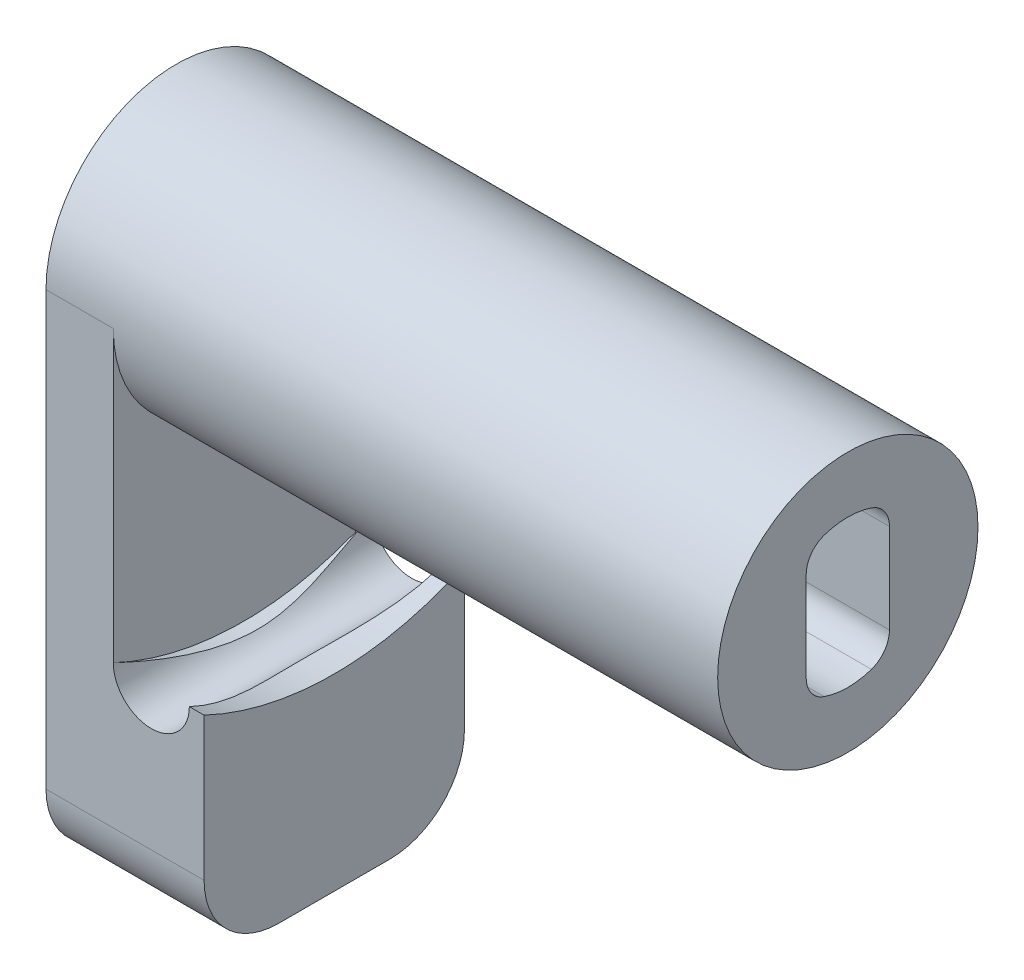
ISO-10303-21;
HEADER;
FILE_DESCRIPTION(('STEP AP214'),'2;1');
FILE_NAME('part.step','',(''),(''),'','','');
FILE_SCHEMA(('AUTOMOTIVE_DESIGN { 1 0 10303 214 1 1 1 1 }'));
ENDSEC;
DATA;
#1=APPLICATION_CONTEXT('core data for automotive mechanical design processes');
#2=APPLICATION_PROTOCOL_DEFINITION('international standard','automotive_design',2000,#1);
#3=PRODUCT_CONTEXT('',#1,'mechanical');
#4=PRODUCT('Part','Part','',(#3));
#5=PRODUCT_RELATED_PRODUCT_CATEGORY('part','',(#4));
#6=PRODUCT_DEFINITION_FORMATION('','',#4);
#7=PRODUCT_DEFINITION_CONTEXT('part definition',#1,'design');
#8=PRODUCT_DEFINITION('design','',#6,#7);
#9=PRODUCT_DEFINITION_SHAPE('','',#8);
#10=(LENGTH_UNIT() NAMED_UNIT(*) SI_UNIT(.MILLI.,.METRE.));
#11=(NAMED_UNIT(*) PLANE_ANGLE_UNIT() SI_UNIT($,.RADIAN.));
#12=(NAMED_UNIT(*) SI_UNIT($,.STERADIAN.) SOLID_ANGLE_UNIT());
#13=UNCERTAINTY_MEASURE_WITH_UNIT(LENGTH_MEASURE(1.E-05),#10,'distance_accuracy_value','');
#14=(GEOMETRIC_REPRESENTATION_CONTEXT(3) GLOBAL_UNCERTAINTY_ASSIGNED_CONTEXT((#13)) GLOBAL_UNIT_ASSIGNED_CONTEXT((#10,
#11,#12)) REPRESENTATION_CONTEXT('',''));
#15=CARTESIAN_POINT('',(0.,0.,0.));
#16=DIRECTION('',(0.,0.,1.));
#17=DIRECTION('',(1.,0.,0.));
#18=AXIS2_PLACEMENT_3D('',#15,#16,#17);
#19=CARTESIAN_POINT('',(-13.1529612058234,-1.08551700717587,0.));
#20=DIRECTION('',(1.,0.,0.));
#21=DIRECTION('',(0.,0.,-1.));
#22=AXIS2_PLACEMENT_3D('',#19,#20,#21);
#23=CYLINDRICAL_SURFACE('',#22,20.32);
#24=CARTESIAN_POINT('',(4.516000112,-19.431,-8.7376));
#25=CARTESIAN_POINT('',(4.51603731749877,-19.5177287528389,-8.5555150718596));
#26=CARTESIAN_POINT('',(4.52041756207572,-19.6017131843481,-8.37218776939642));
#27=CARTESIAN_POINT('',(4.53649669182362,-19.7640441249381,-8.00346974642191));
#28=CARTESIAN_POINT('',(4.54819196914922,-19.8423933921093,-7.81808008733202));
#29=CARTESIAN_POINT('',(4.57750524371221,-19.9932298337656,-7.44587482763609));
#30=CARTESIAN_POINT('',(4.59511059020355,-20.0657291226541,-7.25906309881219));
#31=CARTESIAN_POINT('',(4.6350984527638,-20.2050234726588,-6.88381652494582));
#32=CARTESIAN_POINT('',(4.65748161048571,-20.2718177659139,-6.69538146515752));
#33=CARTESIAN_POINT('',(4.73063386302325,-20.4648184988648,-6.12434180645761));
#34=CARTESIAN_POINT('',(4.78709294470231,-20.5822383370678,-5.73947026967527));
#35=CARTESIAN_POINT('',(4.90685418840569,-20.7938885012978,-4.9642812598655));
#36=CARTESIAN_POINT('',(4.97016061356254,-20.8881042595447,-4.57396052741235));
#37=CARTESIAN_POINT('',(5.09296430268536,-21.0504853530193,-3.80167743454365));
#38=CARTESIAN_POINT('',(5.15251770203577,-21.1194348094891,-3.41988894288582));
#39=CARTESIAN_POINT('',(5.26139557184988,-21.235522973599,-2.65150880361196));
#40=CARTESIAN_POINT('',(5.31072214253996,-21.2826661619228,-2.26491815950602));
#41=CARTESIAN_POINT('',(5.36996981115032,-21.3365954064752,-1.68338288453226));
#42=CARTESIAN_POINT('',(5.38722709898677,-21.3517501970454,-1.48994178039054));
#43=CARTESIAN_POINT('',(5.41595618999079,-21.376527934953,-1.10226762126502));
#44=CARTESIAN_POINT('',(5.42742814364184,-21.3861510261775,-0.908034587012759));
#45=CARTESIAN_POINT('',(5.44384213927347,-21.399814361787,-0.519182820192744));
#46=CARTESIAN_POINT('',(5.4487872492382,-21.4038572292324,-0.324564311936539));
#47=CARTESIAN_POINT('',(5.45182482094318,-21.4063463641171,0.0647645243224691));
#48=CARTESIAN_POINT('',(5.44991713093645,-21.4047925076236,0.25947485426309));
#49=CARTESIAN_POINT('',(5.43791560220297,-21.3949008098425,0.702031122744907));
#50=CARTESIAN_POINT('',(5.42571740508307,-21.3848170128464,0.949783737628716));
#51=CARTESIAN_POINT('',(5.39165308592273,-21.3556506908518,1.44409389752363));
#52=CARTESIAN_POINT('',(5.36978570537389,-21.3365669944351,1.69065128274307));
#53=CARTESIAN_POINT('',(5.31841361275851,-21.2894896279478,2.1824283587983));
#54=CARTESIAN_POINT('',(5.28889873312364,-21.2614840845627,2.42764582157201));
#55=CARTESIAN_POINT('',(5.22459428249614,-21.1966813330368,2.91619580195046));
#56=CARTESIAN_POINT('',(5.18980480135659,-21.1598842746537,3.15952835159059));
#57=CARTESIAN_POINT('',(5.11704832924566,-21.0773221209748,3.64572203666351));
#58=CARTESIAN_POINT('',(5.0790635160548,-21.03150451255,3.88857157186214));
#59=CARTESIAN_POINT('',(5.00229123413209,-20.931076768087,4.37232221506012));
#60=CARTESIAN_POINT('',(4.96350366591518,-20.876465536504,4.61322307635335));
#61=CARTESIAN_POINT('',(4.84906519895848,-20.6995446264881,5.332540827966));
#62=CARTESIAN_POINT('',(4.77524179271125,-20.5640491428703,5.80815334623814));
#63=CARTESIAN_POINT('',(4.68332294902369,-20.3429656895821,6.48856420455001));
#64=CARTESIAN_POINT('',(4.6570609963979,-20.2715032996002,6.69693796652465));
#65=CARTESIAN_POINT('',(4.60994604418476,-20.1216333367819,7.1117720077411));
#66=CARTESIAN_POINT('',(4.58909206679276,-20.0432270229058,7.31823262637574));
#67=CARTESIAN_POINT('',(4.55437450524215,-19.8797799982117,7.72829969041081));
#68=CARTESIAN_POINT('',(4.5404869822015,-19.7947631829191,7.93191353995666));
#69=CARTESIAN_POINT('',(4.52609874323223,-19.6621542658722,8.23548148381315));
#70=CARTESIAN_POINT('',(4.52237634337057,-19.617088565154,8.33639443081653));
#71=CARTESIAN_POINT('',(4.51732854253573,-19.525288679427,8.53753160177582));
#72=CARTESIAN_POINT('',(4.51600340983757,-19.4785543082763,8.63775574739877));
#73=CARTESIAN_POINT('',(4.516000112,-19.431,8.7376));
#74=B_SPLINE_CURVE_WITH_KNOTS('',3,(#24,#25,#26,#27,#28,#29,#30,#31,#32,#33,#34,#35,#36,#37,#38,
#39,#40,#41,#42,#43,#44,#45,#46,#47,#48,#49,#50,#51,#52,#53,#54,#55,#56,#57,#58,#59,#60,#61,#62,
#63,#64,#65,#66,#67,#68,#69,#70,#71,#72,#73),.UNSPECIFIED.,.F.,.F.,(4,2,2,2,2,2,2,2,2,2,2,2,2,2,
2,2,2,2,2,2,2,2,2,2,4),(0.,0.604902094843688,1.20950608108938,1.81282405341211,2.41622310148412,
3.6342575228127,4.8530547015255,6.02995777472376,7.20661891401831,7.79087980929366,
8.37512550645878,8.95909647731702,9.54308037958888,10.2874501190093,11.0319167716234,
11.7773783385945,12.522827208021,13.2727513586984,14.0227690103302,15.5210179611022,
16.1864245199329,16.8517106839849,17.5146947852316,17.8464021322582,18.1781465979217),.UNSPECIFIED.);
#75=CARTESIAN_POINT('',(4.516000112,-19.431,-8.7376));
#76=VERTEX_POINT('',#75);
#77=CARTESIAN_POINT('',(4.516000112,-19.431,8.7376));
#78=VERTEX_POINT('',#77);
#79=EDGE_CURVE('E228',#76,#78,#74,.T.);
#80=ORIENTED_EDGE('',*,*,#79,.F.);
#81=CARTESIAN_POINT('',(4.516000112,-1.08551700717587,0.));
#82=DIRECTION('',(-1.,0.,0.));
#83=DIRECTION('',(0.,0.,1.));
#84=AXIS2_PLACEMENT_3D('',#81,#82,#83);
#85=CIRCLE('',#84,20.32);
#86=EDGE_CURVE('E254',#76,#78,#85,.T.);
#87=ORIENTED_EDGE('',*,*,#86,.T.);
#88=EDGE_LOOP('',(#80,#87));
#89=FACE_BOUND('',#88,.T.);
#90=ADVANCED_FACE('F50',(#89),#23,.F.);
#91=CARTESIAN_POINT('',(45.085,0.,0.));
#92=DIRECTION('',(-1.,0.,0.));
#93=DIRECTION('',(0.,0.,1.));
#94=AXIS2_PLACEMENT_3D('',#91,#92,#93);
#95=CYLINDRICAL_SURFACE('',#94,8.7376);
#96=CARTESIAN_POINT('',(4.516000112,0.,0.));
#97=DIRECTION('',(-1.,0.,0.));
#98=DIRECTION('',(0.,0.,1.));
#99=AXIS2_PLACEMENT_3D('',#96,#97,#98);
#100=CIRCLE('',#99,8.7376);
#101=CARTESIAN_POINT('',(4.516000112,0.,-8.7376));
#102=VERTEX_POINT('',#101);
#103=CARTESIAN_POINT('',(4.516000112,0.,8.7376));
#104=VERTEX_POINT('',#103);
#105=EDGE_CURVE('E283',#102,#104,#100,.T.);
#106=ORIENTED_EDGE('',*,*,#105,.F.);
#107=DIRECTION('',(-1.,0.,0.));
#108=VECTOR('',#107,1.);
#109=CARTESIAN_POINT('',(4.516000112,0.,-8.7376));
#110=LINE('',#109,#108);
#111=CARTESIAN_POINT('',(0.,0.,-8.7376));
#112=VERTEX_POINT('',#111);
#113=EDGE_CURVE('E297',#102,#112,#110,.T.);
#114=ORIENTED_EDGE('',*,*,#113,.T.);
#115=CARTESIAN_POINT('',(0.,0.,0.));
#116=DIRECTION('',(1.,0.,0.));
#117=DIRECTION('',(0.,0.,-1.));
#118=AXIS2_PLACEMENT_3D('',#115,#116,#117);
#119=CIRCLE('',#118,8.7376);
#120=CARTESIAN_POINT('',(0.,0.,8.7376));
#121=VERTEX_POINT('',#120);
#122=EDGE_CURVE('E301',#112,#121,#119,.T.);
#123=ORIENTED_EDGE('',*,*,#122,.T.);
#124=DIRECTION('',(-1.,0.,0.));
#125=VECTOR('',#124,1.);
#126=CARTESIAN_POINT('',(4.516000112,0.,8.7376));
#127=LINE('',#126,#125);
#128=EDGE_CURVE('E287',#104,#121,#127,.T.);
#129=ORIENTED_EDGE('',*,*,#128,.F.);
#130=EDGE_LOOP('',(#106,#114,#123,#129));
#131=FACE_BOUND('',#130,.T.);
#132=CARTESIAN_POINT('',(45.085,0.,0.));
#133=DIRECTION('',(1.,0.,0.));
#134=DIRECTION('',(0.,0.,-1.));
#135=AXIS2_PLACEMENT_3D('',#132,#133,#134);
#136=CIRCLE('',#135,8.7376);
#137=CARTESIAN_POINT('',(45.085,0.,-8.7376));
#138=VERTEX_POINT('',#137);
#139=EDGE_CURVE('E305',#138,#138,#136,.T.);
#140=ORIENTED_EDGE('',*,*,#139,.F.);
#141=EDGE_LOOP('',(#140));
#142=FACE_BOUND('',#141,.T.);
#143=ADVANCED_FACE('F431',(#131,#142),#95,.T.);
#144=CARTESIAN_POINT('',(45.085,0.,0.));
#145=DIRECTION('',(1.,0.,0.));
#146=DIRECTION('',(0.,0.,-1.));
#147=AXIS2_PLACEMENT_3D('',#144,#145,#146);
#148=PLANE('',#147);
#149=CARTESIAN_POINT('',(45.085,0.,0.));
#150=DIRECTION('',(1.,0.,0.));
#151=DIRECTION('',(0.,0.,-1.));
#152=AXIS2_PLACEMENT_3D('',#149,#150,#151);
#153=CIRCLE('',#152,4.953);
#154=CARTESIAN_POINT('',(45.085,4.69255908842926,-1.58496));
#155=VERTEX_POINT('',#154);
#156=CARTESIAN_POINT('',(45.085,4.69255908842926,1.58496));
#157=VERTEX_POINT('',#156);
#158=EDGE_CURVE('E539',#155,#157,#153,.T.);
#159=ORIENTED_EDGE('',*,*,#158,.F.);
#160=CARTESIAN_POINT('',(45.085,3.00805069771106,-1.016));
#161=DIRECTION('',(1.,0.,0.));
#162=DIRECTION('',(0.,0.,-1.));
#163=AXIS2_PLACEMENT_3D('',#160,#161,#162);
#164=CIRCLE('',#163,1.778);
#165=CARTESIAN_POINT('',(45.085,3.00805069771106,-2.794));
#166=VERTEX_POINT('',#165);
#167=EDGE_CURVE('E372',#155,#166,#164,.F.);
#168=ORIENTED_EDGE('',*,*,#167,.T.);
#169=DIRECTION('',(0.,1.,0.));
#170=VECTOR('',#169,1.);
#171=CARTESIAN_POINT('',(45.085,-4.08971551577857,-2.794));
#172=LINE('',#171,#170);
#173=CARTESIAN_POINT('',(45.085,-3.00805069771106,-2.794));
#174=VERTEX_POINT('',#173);
#175=EDGE_CURVE('E546',#174,#166,#172,.T.);
#176=ORIENTED_EDGE('',*,*,#175,.F.);
#177=CARTESIAN_POINT('',(45.085,-3.00805069771106,-1.016));
#178=DIRECTION('',(1.,0.,0.));
#179=DIRECTION('',(0.,0.,-1.));
#180=AXIS2_PLACEMENT_3D('',#177,#178,#179);
#181=CIRCLE('',#180,1.778);
#182=CARTESIAN_POINT('',(45.085,-4.69255908842926,-1.58496));
#183=VERTEX_POINT('',#182);
#184=EDGE_CURVE('E378',#174,#183,#181,.F.);
#185=ORIENTED_EDGE('',*,*,#184,.T.);
#186=CARTESIAN_POINT('',(45.085,0.,0.));
#187=DIRECTION('',(1.,0.,0.));
#188=DIRECTION('',(0.,0.,-1.));
#189=AXIS2_PLACEMENT_3D('',#186,#187,#188);
#190=CIRCLE('',#189,4.953);
#191=CARTESIAN_POINT('',(45.085,-4.69255908842926,1.58496));
#192=VERTEX_POINT('',#191);
#193=EDGE_CURVE('E565',#192,#183,#190,.T.);
#194=ORIENTED_EDGE('',*,*,#193,.F.);
#195=CARTESIAN_POINT('',(45.085,-3.00805069771106,1.016));
#196=DIRECTION('',(1.,0.,0.));
#197=DIRECTION('',(0.,0.,-1.));
#198=AXIS2_PLACEMENT_3D('',#195,#196,#197);
#199=CIRCLE('',#198,1.778);
#200=CARTESIAN_POINT('',(45.085,-3.00805069771106,2.794));
#201=VERTEX_POINT('',#200);
#202=EDGE_CURVE('E229',#192,#201,#199,.F.);
#203=ORIENTED_EDGE('',*,*,#202,.T.);
#204=DIRECTION('',(0.,-1.,0.));
#205=VECTOR('',#204,1.);
#206=CARTESIAN_POINT('',(45.085,-4.08971551577857,2.794));
#207=LINE('',#206,#205);
#208=CARTESIAN_POINT('',(45.085,3.00805069771106,2.794));
#209=VERTEX_POINT('',#208);
#210=EDGE_CURVE('E561',#209,#201,#207,.T.);
#211=ORIENTED_EDGE('',*,*,#210,.F.);
#212=CARTESIAN_POINT('',(45.085,3.00805069771106,1.016));
#213=DIRECTION('',(1.,0.,0.));
#214=DIRECTION('',(0.,0.,-1.));
#215=AXIS2_PLACEMENT_3D('',#212,#213,#214);
#216=CIRCLE('',#215,1.778);
#217=EDGE_CURVE('E375',#209,#157,#216,.F.);
#218=ORIENTED_EDGE('',*,*,#217,.T.);
#219=EDGE_LOOP('',(#159,#168,#176,#185,#194,#203,#211,#218));
#220=FACE_BOUND('',#219,.T.);
#221=ORIENTED_EDGE('',*,*,#139,.T.);
#222=EDGE_LOOP('',(#221));
#223=FACE_BOUND('',#222,.T.);
#224=ADVANCED_FACE('F438',(#220,#223),#148,.T.);
#225=CARTESIAN_POINT('',(0.,0.,0.));
#226=DIRECTION('',(1.,0.,0.));
#227=DIRECTION('',(0.,0.,-1.));
#228=AXIS2_PLACEMENT_3D('',#225,#226,#227);
#229=PLANE('',#228);
#230=CARTESIAN_POINT('',(0.,0.,0.));
#231=DIRECTION('',(-1.,0.,0.));
#232=DIRECTION('',(0.,0.,1.));
#233=AXIS2_PLACEMENT_3D('',#230,#231,#232);
#234=CIRCLE('',#233,4.064);
#235=CARTESIAN_POINT('',(0.,-3.6397595594402,1.80782918149466));
#236=VERTEX_POINT('',#235);
#237=CARTESIAN_POINT('',(0.,-3.6397595594402,-1.80782918149466));
#238=VERTEX_POINT('',#237);
#239=EDGE_CURVE('E530',#236,#238,#234,.T.);
#240=ORIENTED_EDGE('',*,*,#239,.F.);
#241=CARTESIAN_POINT('',(0.,-3.99520482891678,1.984375));
#242=DIRECTION('',(1.,0.,0.));
#243=DIRECTION('',(0.,0.,-1.));
#244=AXIS2_PLACEMENT_3D('',#241,#242,#243);
#245=CIRCLE('',#244,0.396875);
#246=CARTESIAN_POINT('',(0.,-3.99520482891678,1.5875));
#247=VERTEX_POINT('',#246);
#248=EDGE_CURVE('E457',#236,#247,#245,.F.);
#249=ORIENTED_EDGE('',*,*,#248,.T.);
#250=DIRECTION('',(0.,1.,0.));
#251=VECTOR('',#250,1.);
#252=CARTESIAN_POINT('',(0.,-3.74111477370048,1.5875));
#253=LINE('',#252,#251);
#254=CARTESIAN_POINT('',(0.,-4.99523977370048,1.5875));
#255=VERTEX_POINT('',#254);
#256=EDGE_CURVE('E501',#255,#247,#253,.T.);
#257=ORIENTED_EDGE('',*,*,#256,.F.);
#258=CARTESIAN_POINT('',(0.,-4.99523977370048,1.190625));
#259=DIRECTION('',(1.,0.,0.));
#260=DIRECTION('',(0.,0.,-1.));
#261=AXIS2_PLACEMENT_3D('',#258,#259,#260);
#262=CIRCLE('',#261,0.396875);
#263=CARTESIAN_POINT('',(0.,-5.39211477370048,1.190625));
#264=VERTEX_POINT('',#263);
#265=EDGE_CURVE('E489',#255,#264,#262,.T.);
#266=ORIENTED_EDGE('',*,*,#265,.T.);
#267=DIRECTION('',(0.,0.,1.));
#268=VECTOR('',#267,1.);
#269=CARTESIAN_POINT('',(0.,-5.39211477370048,1.5875));
#270=LINE('',#269,#268);
#271=CARTESIAN_POINT('',(0.,-5.39211477370048,-1.190625));
#272=VERTEX_POINT('',#271);
#273=EDGE_CURVE('E499',#272,#264,#270,.T.);
#274=ORIENTED_EDGE('',*,*,#273,.F.);
#275=CARTESIAN_POINT('',(0.,-4.99523977370048,-1.190625));
#276=DIRECTION('',(1.,0.,0.));
#277=DIRECTION('',(0.,0.,-1.));
#278=AXIS2_PLACEMENT_3D('',#275,#276,#277);
#279=CIRCLE('',#278,0.396875);
#280=CARTESIAN_POINT('',(0.,-4.99523977370048,-1.5875));
#281=VERTEX_POINT('',#280);
#282=EDGE_CURVE('E12',#272,#281,#279,.T.);
#283=ORIENTED_EDGE('',*,*,#282,.T.);
#284=DIRECTION('',(0.,-1.,0.));
#285=VECTOR('',#284,1.);
#286=CARTESIAN_POINT('',(0.,-3.74111477370048,-1.5875));
#287=LINE('',#286,#285);
#288=CARTESIAN_POINT('',(0.,-3.99520482891678,-1.5875));
#289=VERTEX_POINT('',#288);
#290=EDGE_CURVE('E511',#289,#281,#287,.T.);
#291=ORIENTED_EDGE('',*,*,#290,.F.);
#292=CARTESIAN_POINT('',(0.,-3.99520482891678,-1.984375));
#293=DIRECTION('',(1.,0.,0.));
#294=DIRECTION('',(0.,0.,-1.));
#295=AXIS2_PLACEMENT_3D('',#292,#293,#294);
#296=CIRCLE('',#295,0.396875);
#297=EDGE_CURVE('E452',#289,#238,#296,.F.);
#298=ORIENTED_EDGE('',*,*,#297,.T.);
#299=EDGE_LOOP('',(#240,#249,#257,#266,#274,#283,#291,#298));
#300=FACE_BOUND('',#299,.T.);
#301=DIRECTION('',(0.,0.,-1.));
#302=VECTOR('',#301,1.);
#303=CARTESIAN_POINT('',(0.,-34.036,0.));
#304=LINE('',#303,#302);
#305=CARTESIAN_POINT('',(0.,-34.036,3.7376));
#306=VERTEX_POINT('',#305);
#307=CARTESIAN_POINT('',(0.,-34.036,-3.7376));
#308=VERTEX_POINT('',#307);
#309=EDGE_CURVE('E290',#306,#308,#304,.T.);
#310=ORIENTED_EDGE('',*,*,#309,.F.);
#311=CARTESIAN_POINT('',(0.,-29.036,3.7376));
#312=DIRECTION('',(1.,0.,0.));
#313=DIRECTION('',(0.,0.,-1.));
#314=AXIS2_PLACEMENT_3D('',#311,#312,#313);
#315=CIRCLE('',#314,5.);
#316=CARTESIAN_POINT('',(0.,-29.036,8.7376));
#317=VERTEX_POINT('',#316);
#318=EDGE_CURVE('E321',#306,#317,#315,.F.);
#319=ORIENTED_EDGE('',*,*,#318,.T.);
#320=DIRECTION('',(0.,-1.,0.));
#321=VECTOR('',#320,1.);
#322=CARTESIAN_POINT('',(0.,0.,8.7376));
#323=LINE('',#322,#321);
#324=EDGE_CURVE('E279',#121,#317,#323,.T.);
#325=ORIENTED_EDGE('',*,*,#324,.F.);
#326=ORIENTED_EDGE('',*,*,#122,.F.);
#327=DIRECTION('',(0.,1.,0.));
#328=VECTOR('',#327,1.);
#329=CARTESIAN_POINT('',(0.,0.,-8.7376));
#330=LINE('',#329,#328);
#331=CARTESIAN_POINT('',(0.,-29.036,-8.7376));
#332=VERTEX_POINT('',#331);
#333=EDGE_CURVE('E275',#332,#112,#330,.T.);
#334=ORIENTED_EDGE('',*,*,#333,.F.);
#335=CARTESIAN_POINT('',(0.,-29.036,-3.7376));
#336=DIRECTION('',(1.,0.,0.));
#337=DIRECTION('',(0.,0.,-1.));
#338=AXIS2_PLACEMENT_3D('',#335,#336,#337);
#339=CIRCLE('',#338,5.);
#340=EDGE_CURVE('E318',#332,#308,#339,.F.);
#341=ORIENTED_EDGE('',*,*,#340,.T.);
#342=EDGE_LOOP('',(#310,#319,#325,#326,#334,#341));
#343=FACE_BOUND('',#342,.T.);
#344=ADVANCED_FACE('F497',(#300,#343),#229,.F.);
#345=CARTESIAN_POINT('',(4.516000112,0.,-8.7376));
#346=DIRECTION('',(0.,0.,1.));
#347=DIRECTION('',(0.,-1.,0.));
#348=AXIS2_PLACEMENT_3D('',#345,#346,#347);
#349=PLANE('',#348);
#350=DIRECTION('',(0.,1.,0.));
#351=VECTOR('',#350,1.);
#352=CARTESIAN_POINT('',(4.516000112,0.,-8.7376));
#353=LINE('',#352,#351);
#354=EDGE_CURVE('E238',#76,#102,#353,.T.);
#355=ORIENTED_EDGE('',*,*,#354,.F.);
#356=CARTESIAN_POINT('',(7.068700112,-19.431,-8.7376));
#357=DIRECTION('',(0.,0.,-1.));
#358=DIRECTION('',(0.,1.,0.));
#359=AXIS2_PLACEMENT_3D('',#356,#357,#358);
#360=CIRCLE('',#359,2.5527);
#361=CARTESIAN_POINT('',(9.621400112,-19.431,-8.7376));
#362=VERTEX_POINT('',#361);
#363=EDGE_CURVE('E220',#362,#76,#360,.T.);
#364=ORIENTED_EDGE('',*,*,#363,.F.);
#365=DIRECTION('',(1.,0.,0.));
#366=VECTOR('',#365,1.);
#367=CARTESIAN_POINT('',(-13.1529612058234,-19.431,-8.7376));
#368=LINE('',#367,#366);
#369=CARTESIAN_POINT('',(10.612000112,-19.431,-8.7376));
#370=VERTEX_POINT('',#369);
#371=EDGE_CURVE('E235',#362,#370,#368,.T.);
#372=ORIENTED_EDGE('',*,*,#371,.T.);
#373=DIRECTION('',(0.,1.,0.));
#374=VECTOR('',#373,1.);
#375=CARTESIAN_POINT('',(10.612000112,0.,-8.7376));
#376=LINE('',#375,#374);
#377=CARTESIAN_POINT('',(10.612000112,-29.036,-8.7376));
#378=VERTEX_POINT('',#377);
#379=EDGE_CURVE('E272',#378,#370,#376,.T.);
#380=ORIENTED_EDGE('',*,*,#379,.F.);
#381=DIRECTION('',(-1.,0.,0.));
#382=VECTOR('',#381,1.);
#383=CARTESIAN_POINT('',(4.516000112,-29.036,-8.7376));
#384=LINE('',#383,#382);
#385=EDGE_CURVE('E328',#378,#332,#384,.T.);
#386=ORIENTED_EDGE('',*,*,#385,.T.);
#387=ORIENTED_EDGE('',*,*,#333,.T.);
#388=ORIENTED_EDGE('',*,*,#113,.F.);
#389=EDGE_LOOP('',(#355,#364,#372,#380,#386,#387,#388));
#390=FACE_BOUND('',#389,.T.);
#391=ADVANCED_FACE('F233',(#390),#349,.F.);
#392=CARTESIAN_POINT('',(4.516000112,0.,8.7376));
#393=DIRECTION('',(0.,0.,-1.));
#394=DIRECTION('',(0.,1.,0.));
#395=AXIS2_PLACEMENT_3D('',#392,#393,#394);
#396=PLANE('',#395);
#397=DIRECTION('',(1.,0.,0.));
#398=VECTOR('',#397,1.);
#399=CARTESIAN_POINT('',(-13.1529612058234,-19.431,8.7376));
#400=LINE('',#399,#398);
#401=CARTESIAN_POINT('',(9.621400112,-19.431,8.7376));
#402=VERTEX_POINT('',#401);
#403=CARTESIAN_POINT('',(10.612000112,-19.431,8.7376));
#404=VERTEX_POINT('',#403);
#405=EDGE_CURVE('E248',#402,#404,#400,.T.);
#406=ORIENTED_EDGE('',*,*,#405,.F.);
#407=CARTESIAN_POINT('',(7.068700112,-19.431,8.7376));
#408=DIRECTION('',(0.,0.,-1.));
#409=DIRECTION('',(0.,1.,0.));
#410=AXIS2_PLACEMENT_3D('',#407,#408,#409);
#411=CIRCLE('',#410,2.5527);
#412=EDGE_CURVE('E223',#402,#78,#411,.T.);
#413=ORIENTED_EDGE('',*,*,#412,.T.);
#414=DIRECTION('',(0.,-1.,0.));
#415=VECTOR('',#414,1.);
#416=CARTESIAN_POINT('',(4.516000112,0.,8.7376));
#417=LINE('',#416,#415);
#418=EDGE_CURVE('E278',#104,#78,#417,.T.);
#419=ORIENTED_EDGE('',*,*,#418,.F.);
#420=ORIENTED_EDGE('',*,*,#128,.T.);
#421=ORIENTED_EDGE('',*,*,#324,.T.);
#422=DIRECTION('',(-1.,0.,0.));
#423=VECTOR('',#422,1.);
#424=CARTESIAN_POINT('',(4.516000112,-29.036,8.7376));
#425=LINE('',#424,#423);
#426=CARTESIAN_POINT('',(10.612000112,-29.036,8.7376));
#427=VERTEX_POINT('',#426);
#428=EDGE_CURVE('E324',#317,#427,#425,.F.);
#429=ORIENTED_EDGE('',*,*,#428,.T.);
#430=DIRECTION('',(0.,-1.,0.));
#431=VECTOR('',#430,1.);
#432=CARTESIAN_POINT('',(10.612000112,0.,8.7376));
#433=LINE('',#432,#431);
#434=EDGE_CURVE('E252',#404,#427,#433,.T.);
#435=ORIENTED_EDGE('',*,*,#434,.F.);
#436=EDGE_LOOP('',(#406,#413,#419,#420,#421,#429,#435));
#437=FACE_BOUND('',#436,.T.);
#438=ADVANCED_FACE('F798',(#437),#396,.F.);
#439=CARTESIAN_POINT('',(4.516000112,-34.036,0.));
#440=DIRECTION('',(0.,1.,0.));
#441=DIRECTION('',(0.,0.,1.));
#442=AXIS2_PLACEMENT_3D('',#439,#440,#441);
#443=PLANE('',#442);
#444=DIRECTION('',(-1.,0.,0.));
#445=VECTOR('',#444,1.);
#446=CARTESIAN_POINT('',(4.516000112,-34.036,-3.7376));
#447=LINE('',#446,#445);
#448=CARTESIAN_POINT('',(10.612000112,-34.036,-3.7376));
#449=VERTEX_POINT('',#448);
#450=EDGE_CURVE('E309',#308,#449,#447,.F.);
#451=ORIENTED_EDGE('',*,*,#450,.T.);
#452=DIRECTION('',(0.,0.,-1.));
#453=VECTOR('',#452,1.);
#454=CARTESIAN_POINT('',(10.612000112,-34.036,0.));
#455=LINE('',#454,#453);
#456=CARTESIAN_POINT('',(10.612000112,-34.036,3.7376));
#457=VERTEX_POINT('',#456);
#458=EDGE_CURVE('E264',#457,#449,#455,.T.);
#459=ORIENTED_EDGE('',*,*,#458,.F.);
#460=DIRECTION('',(-1.,0.,0.));
#461=VECTOR('',#460,1.);
#462=CARTESIAN_POINT('',(4.516000112,-34.036,3.7376));
#463=LINE('',#462,#461);
#464=EDGE_CURVE('E314',#457,#306,#463,.T.);
#465=ORIENTED_EDGE('',*,*,#464,.T.);
#466=ORIENTED_EDGE('',*,*,#309,.T.);
#467=EDGE_LOOP('',(#451,#459,#465,#466));
#468=FACE_BOUND('',#467,.T.);
#469=ADVANCED_FACE('F789',(#468),#443,.F.);
#470=CARTESIAN_POINT('',(4.516000112,0.,0.));
#471=DIRECTION('',(-1.,0.,0.));
#472=DIRECTION('',(0.,0.,1.));
#473=AXIS2_PLACEMENT_3D('',#470,#471,#472);
#474=PLANE('',#473);
#475=ORIENTED_EDGE('',*,*,#418,.T.);
#476=ORIENTED_EDGE('',*,*,#86,.F.);
#477=ORIENTED_EDGE('',*,*,#354,.T.);
#478=ORIENTED_EDGE('',*,*,#105,.T.);
#479=EDGE_LOOP('',(#475,#476,#477,#478));
#480=FACE_BOUND('',#479,.T.);
#481=ADVANCED_FACE('F614',(#480),#474,.F.);
#482=CARTESIAN_POINT('',(4.516000112,-29.036,3.7376));
#483=DIRECTION('',(-1.,0.,0.));
#484=DIRECTION('',(0.,0.,1.));
#485=AXIS2_PLACEMENT_3D('',#482,#483,#484);
#486=CYLINDRICAL_SURFACE('',#485,5.);
#487=ORIENTED_EDGE('',*,*,#464,.F.);
#488=CARTESIAN_POINT('',(10.612000112,-29.036,3.7376));
#489=DIRECTION('',(1.,0.,0.));
#490=DIRECTION('',(0.,0.,-1.));
#491=AXIS2_PLACEMENT_3D('',#488,#489,#490);
#492=CIRCLE('',#491,5.);
#493=EDGE_CURVE('E260',#427,#457,#492,.T.);
#494=ORIENTED_EDGE('',*,*,#493,.F.);
#495=ORIENTED_EDGE('',*,*,#428,.F.);
#496=ORIENTED_EDGE('',*,*,#318,.F.);
#497=EDGE_LOOP('',(#487,#494,#495,#496));
#498=FACE_BOUND('',#497,.T.);
#499=ADVANCED_FACE('F610',(#498),#486,.T.);
#500=CARTESIAN_POINT('',(4.516000112,-29.036,-3.7376));
#501=DIRECTION('',(-1.,0.,0.));
#502=DIRECTION('',(0.,0.,1.));
#503=AXIS2_PLACEMENT_3D('',#500,#501,#502);
#504=CYLINDRICAL_SURFACE('',#503,5.);
#505=ORIENTED_EDGE('',*,*,#385,.F.);
#506=CARTESIAN_POINT('',(10.612000112,-29.036,-3.7376));
#507=DIRECTION('',(1.,0.,0.));
#508=DIRECTION('',(0.,0.,-1.));
#509=AXIS2_PLACEMENT_3D('',#506,#507,#508);
#510=CIRCLE('',#509,5.);
#511=EDGE_CURVE('E268',#449,#378,#510,.T.);
#512=ORIENTED_EDGE('',*,*,#511,.F.);
#513=ORIENTED_EDGE('',*,*,#450,.F.);
#514=ORIENTED_EDGE('',*,*,#340,.F.);
#515=EDGE_LOOP('',(#505,#512,#513,#514));
#516=FACE_BOUND('',#515,.T.);
#517=ADVANCED_FACE('F613',(#516),#504,.T.);
#518=CARTESIAN_POINT('',(10.612000112,0.,0.));
#519=DIRECTION('',(1.,0.,0.));
#520=DIRECTION('',(0.,0.,-1.));
#521=AXIS2_PLACEMENT_3D('',#518,#519,#520);
#522=PLANE('',#521);
#523=ORIENTED_EDGE('',*,*,#379,.T.);
#524=CARTESIAN_POINT('',(10.612000112,-1.08551700717587,0.));
#525=DIRECTION('',(1.,0.,0.));
#526=DIRECTION('',(0.,0.,-1.));
#527=AXIS2_PLACEMENT_3D('',#524,#525,#526);
#528=CIRCLE('',#527,20.32);
#529=EDGE_CURVE('E245',#370,#404,#528,.F.);
#530=ORIENTED_EDGE('',*,*,#529,.T.);
#531=ORIENTED_EDGE('',*,*,#434,.T.);
#532=ORIENTED_EDGE('',*,*,#493,.T.);
#533=ORIENTED_EDGE('',*,*,#458,.T.);
#534=ORIENTED_EDGE('',*,*,#511,.T.);
#535=EDGE_LOOP('',(#523,#530,#531,#532,#533,#534));
#536=FACE_BOUND('',#535,.T.);
#537=ADVANCED_FACE('F428',(#536),#522,.T.);
#538=CARTESIAN_POINT('',(9.621400112,-19.431,8.73760000000001));
#539=CARTESIAN_POINT('',(9.62136290650122,-19.5177287528389,8.55551507185961));
#540=CARTESIAN_POINT('',(9.61698266192428,-19.6017131843481,8.37218776939643));
#541=CARTESIAN_POINT('',(9.60090353217638,-19.7640441249381,8.00346974642192));
#542=CARTESIAN_POINT('',(9.58920825485078,-19.8423933921093,7.81808008733204));
#543=CARTESIAN_POINT('',(9.55989498028779,-19.9932298337656,7.4458748276361));
#544=CARTESIAN_POINT('',(9.54228963379645,-20.0657291226541,7.25906309881221));
#545=CARTESIAN_POINT('',(9.5023017712362,-20.2050234726588,6.88381652494584));
#546=CARTESIAN_POINT('',(9.47991861351429,-20.2718177659139,6.69538146515754));
#547=CARTESIAN_POINT('',(9.40676636097675,-20.4648184988648,6.12434180645763));
#548=CARTESIAN_POINT('',(9.35030727929769,-20.5822383370678,5.73947026967529));
#549=CARTESIAN_POINT('',(9.23054603559431,-20.7938885012978,4.96428125986553));
#550=CARTESIAN_POINT('',(9.16723961043746,-20.8881042595446,4.57396052741238));
#551=CARTESIAN_POINT('',(9.04443592131464,-21.0504853530193,3.80167743454368));
#552=CARTESIAN_POINT('',(8.98488252196424,-21.1194348094891,3.41988894288584));
#553=CARTESIAN_POINT('',(8.87600465215012,-21.235522973599,2.65150880361197));
#554=CARTESIAN_POINT('',(8.82667808146003,-21.2826661619228,2.26491815950603));
#555=CARTESIAN_POINT('',(8.76743041284968,-21.3365954064752,1.68338288453227));
#556=CARTESIAN_POINT('',(8.75017312501324,-21.3517501970454,1.48994178039055));
#557=CARTESIAN_POINT('',(8.72144403400921,-21.376527934953,1.10226762126502));
#558=CARTESIAN_POINT('',(8.70997208035815,-21.3861510261775,0.908034587012754));
#559=CARTESIAN_POINT('',(8.69355808472652,-21.399814361787,0.519182820192736));
#560=CARTESIAN_POINT('',(8.6886129747618,-21.4038572292324,0.324564311936529));
#561=CARTESIAN_POINT('',(8.68557540305681,-21.4063463641171,-0.0647645243224828));
#562=CARTESIAN_POINT('',(8.68748309306355,-21.4047925076236,-0.259474854263106));
#563=CARTESIAN_POINT('',(8.69948462179703,-21.3949008098425,-0.702031122744926));
#564=CARTESIAN_POINT('',(8.71168281891693,-21.3848170128464,-0.949783737628736));
#565=CARTESIAN_POINT('',(8.74574713807727,-21.3556506908518,-1.44409389752365));
#566=CARTESIAN_POINT('',(8.76761451862611,-21.3365669944351,-1.69065128274309));
#567=CARTESIAN_POINT('',(8.8189866112415,-21.2894896279478,-2.18242835879833));
#568=CARTESIAN_POINT('',(8.84850149087637,-21.2614840845627,-2.42764582157203));
#569=CARTESIAN_POINT('',(8.91280594150386,-21.1966813330368,-2.91619580195049));
#570=CARTESIAN_POINT('',(8.94759542264341,-21.1598842746537,-3.15952835159061));
#571=CARTESIAN_POINT('',(9.02035189475434,-21.0773221209747,-3.64572203666354));
#572=CARTESIAN_POINT('',(9.0583367079452,-21.0315045125499,-3.88857157186217));
#573=CARTESIAN_POINT('',(9.13510898986792,-20.931076768087,-4.37232221506015));
#574=CARTESIAN_POINT('',(9.17389655808482,-20.876465536504,-4.61322307635338));
#575=CARTESIAN_POINT('',(9.28833502504152,-20.6995446264881,-5.33254082796604));
#576=CARTESIAN_POINT('',(9.36215843128875,-20.5640491428703,-5.80815334623818));
#577=CARTESIAN_POINT('',(9.45407727497632,-20.3429656895821,-6.48856420455005));
#578=CARTESIAN_POINT('',(9.4803392276021,-20.2715032996002,-6.69693796652469));
#579=CARTESIAN_POINT('',(9.52745417981524,-20.1216333367819,-7.11177200774113));
#580=CARTESIAN_POINT('',(9.54830815720724,-20.0432270229058,-7.31823262637576));
#581=CARTESIAN_POINT('',(9.58302571875785,-19.8797799982117,-7.72829969041083));
#582=CARTESIAN_POINT('',(9.59691324179849,-19.7947631829191,-7.93191353995668));
#583=CARTESIAN_POINT('',(9.61130148076776,-19.6621542658722,-8.23548148381315));
#584=CARTESIAN_POINT('',(9.61502388062943,-19.617088565154,-8.33639443081653));
#585=CARTESIAN_POINT('',(9.62007168146426,-19.525288679427,-8.53753160177582));
#586=CARTESIAN_POINT('',(9.62139681416243,-19.4785543082763,-8.63775574739877));
#587=CARTESIAN_POINT('',(9.621400112,-19.431,-8.7376));
#588=B_SPLINE_CURVE_WITH_KNOTS('',3,(#538,#539,#540,#541,#542,#543,#544,#545,#546,#547,#548,
#549,#550,#551,#552,#553,#554,#555,#556,#557,#558,#559,#560,#561,#562,#563,#564,#565,#566,#567,
#568,#569,#570,#571,#572,#573,#574,#575,#576,#577,#578,#579,#580,#581,#582,#583,#584,#585,#586,
#587),.UNSPECIFIED.,.F.,.F.,(4,2,2,2,2,2,2,2,2,2,2,2,2,2,2,2,2,2,2,2,2,2,2,2,4),(0.,
0.604902094843686,1.20950608108937,1.81282405341211,2.41622310148411,3.63425752281268,
4.85305470152548,6.02995777472375,7.20661891401831,7.79087980929367,8.37512550645879,
8.95909647731704,9.5430803795889,10.2874501190093,11.0319167716235,11.7773783385945,
12.5228272080211,13.2727513586984,14.0227690103302,15.5210179611022,16.1864245199329,
16.851710683985,17.5146947852316,17.8464021322582,18.1781465979217),.UNSPECIFIED.);
#589=EDGE_CURVE('E217',#402,#362,#588,.T.);
#590=ORIENTED_EDGE('',*,*,#589,.F.);
#591=ORIENTED_EDGE('',*,*,#405,.T.);
#592=ORIENTED_EDGE('',*,*,#529,.F.);
#593=ORIENTED_EDGE('',*,*,#371,.F.);
#594=EDGE_LOOP('',(#590,#591,#592,#593));
#595=FACE_BOUND('',#594,.T.);
#596=ADVANCED_FACE('F243',(#595),#23,.F.);
#597=CARTESIAN_POINT('',(32.893,0.,0.));
#598=DIRECTION('',(1.,0.,0.));
#599=DIRECTION('',(0.,0.,-1.));
#600=AXIS2_PLACEMENT_3D('',#597,#598,#599);
#601=CYLINDRICAL_SURFACE('',#600,4.953);
#602=CARTESIAN_POINT('',(32.893,0.,0.));
#603=DIRECTION('',(1.,0.,0.));
#604=DIRECTION('',(0.,0.,-1.));
#605=AXIS2_PLACEMENT_3D('',#602,#603,#604);
#606=CIRCLE('',#605,4.953);
#607=CARTESIAN_POINT('',(32.893,4.69255908842926,-1.58496));
#608=VERTEX_POINT('',#607);
#609=CARTESIAN_POINT('',(32.893,4.69255908842926,1.58496));
#610=VERTEX_POINT('',#609);
#611=EDGE_CURVE('E541',#608,#610,#606,.T.);
#612=ORIENTED_EDGE('',*,*,#611,.F.);
#613=DIRECTION('',(1.,0.,0.));
#614=VECTOR('',#613,1.);
#615=CARTESIAN_POINT('',(32.893,4.69255908842926,-1.58496));
#616=LINE('',#615,#614);
#617=EDGE_CURVE('E335',#608,#155,#616,.T.);
#618=ORIENTED_EDGE('',*,*,#617,.T.);
#619=ORIENTED_EDGE('',*,*,#158,.T.);
#620=DIRECTION('',(1.,0.,0.));
#621=VECTOR('',#620,1.);
#622=CARTESIAN_POINT('',(32.893,4.69255908842926,1.58496));
#623=LINE('',#622,#621);
#624=EDGE_CURVE('E332',#157,#610,#623,.F.);
#625=ORIENTED_EDGE('',*,*,#624,.T.);
#626=EDGE_LOOP('',(#612,#618,#619,#625));
#627=FACE_BOUND('',#626,.T.);
#628=ADVANCED_FACE('F415',(#627),#601,.F.);
#629=CARTESIAN_POINT('',(32.893,-4.08971551577857,-2.794));
#630=DIRECTION('',(0.,0.,-1.));
#631=DIRECTION('',(-1.,0.,0.));
#632=AXIS2_PLACEMENT_3D('',#629,#630,#631);
#633=PLANE('',#632);
#634=ORIENTED_EDGE('',*,*,#175,.T.);
#635=DIRECTION('',(-1.,0.,0.));
#636=VECTOR('',#635,1.);
#637=CARTESIAN_POINT('',(32.893,3.00805069771106,-2.794));
#638=LINE('',#637,#636);
#639=CARTESIAN_POINT('',(32.893,3.00805069771106,-2.794));
#640=VERTEX_POINT('',#639);
#641=EDGE_CURVE('E343',#166,#640,#638,.T.);
#642=ORIENTED_EDGE('',*,*,#641,.T.);
#643=DIRECTION('',(0.,1.,0.));
#644=VECTOR('',#643,1.);
#645=CARTESIAN_POINT('',(32.893,-4.08971551577857,-2.794));
#646=LINE('',#645,#644);
#647=CARTESIAN_POINT('',(32.893,-3.00805069771106,-2.794));
#648=VERTEX_POINT('',#647);
#649=EDGE_CURVE('E554',#648,#640,#646,.T.);
#650=ORIENTED_EDGE('',*,*,#649,.F.);
#651=DIRECTION('',(-1.,0.,0.));
#652=VECTOR('',#651,1.);
#653=CARTESIAN_POINT('',(45.085,-3.00805069771106,-2.794));
#654=LINE('',#653,#652);
#655=EDGE_CURVE('E339',#648,#174,#654,.F.);
#656=ORIENTED_EDGE('',*,*,#655,.T.);
#657=EDGE_LOOP('',(#634,#642,#650,#656));
#658=FACE_BOUND('',#657,.T.);
#659=ADVANCED_FACE('F411',(#658),#633,.F.);
#660=CARTESIAN_POINT('',(32.893,0.,0.));
#661=DIRECTION('',(1.,0.,0.));
#662=DIRECTION('',(0.,0.,-1.));
#663=AXIS2_PLACEMENT_3D('',#660,#661,#662);
#664=CYLINDRICAL_SURFACE('',#663,4.953);
#665=ORIENTED_EDGE('',*,*,#193,.T.);
#666=DIRECTION('',(1.,0.,0.));
#667=VECTOR('',#666,1.);
#668=CARTESIAN_POINT('',(32.893,-4.69255908842926,-1.58496));
#669=LINE('',#668,#667);
#670=CARTESIAN_POINT('',(32.893,-4.69255908842926,-1.58496));
#671=VERTEX_POINT('',#670);
#672=EDGE_CURVE('E369',#183,#671,#669,.F.);
#673=ORIENTED_EDGE('',*,*,#672,.T.);
#674=CARTESIAN_POINT('',(32.893,0.,0.));
#675=DIRECTION('',(1.,0.,0.));
#676=DIRECTION('',(0.,0.,-1.));
#677=AXIS2_PLACEMENT_3D('',#674,#675,#676);
#678=CIRCLE('',#677,4.953);
#679=CARTESIAN_POINT('',(32.893,-4.69255908842926,1.58496));
#680=VERTEX_POINT('',#679);
#681=EDGE_CURVE('E550',#680,#671,#678,.T.);
#682=ORIENTED_EDGE('',*,*,#681,.F.);
#683=DIRECTION('',(1.,0.,0.));
#684=VECTOR('',#683,1.);
#685=CARTESIAN_POINT('',(32.893,-4.69255908842926,1.58496));
#686=LINE('',#685,#684);
#687=EDGE_CURVE('E365',#680,#192,#686,.T.);
#688=ORIENTED_EDGE('',*,*,#687,.T.);
#689=EDGE_LOOP('',(#665,#673,#682,#688));
#690=FACE_BOUND('',#689,.T.);
#691=ADVANCED_FACE('F414',(#690),#664,.F.);
#692=CARTESIAN_POINT('',(32.893,-4.08971551577857,2.794));
#693=DIRECTION('',(0.,0.,1.));
#694=DIRECTION('',(1.,0.,0.));
#695=AXIS2_PLACEMENT_3D('',#692,#693,#694);
#696=PLANE('',#695);
#697=DIRECTION('',(0.,-1.,0.));
#698=VECTOR('',#697,1.);
#699=CARTESIAN_POINT('',(32.893,-4.08971551577857,2.794));
#700=LINE('',#699,#698);
#701=CARTESIAN_POINT('',(32.893,3.00805069771106,2.794));
#702=VERTEX_POINT('',#701);
#703=CARTESIAN_POINT('',(32.893,-3.00805069771106,2.794));
#704=VERTEX_POINT('',#703);
#705=EDGE_CURVE('E545',#702,#704,#700,.T.);
#706=ORIENTED_EDGE('',*,*,#705,.F.);
#707=DIRECTION('',(-1.,0.,0.));
#708=VECTOR('',#707,1.);
#709=CARTESIAN_POINT('',(45.085,3.00805069771106,2.794));
#710=LINE('',#709,#708);
#711=EDGE_CURVE('E361',#702,#209,#710,.F.);
#712=ORIENTED_EDGE('',*,*,#711,.T.);
#713=ORIENTED_EDGE('',*,*,#210,.T.);
#714=DIRECTION('',(-1.,0.,0.));
#715=VECTOR('',#714,1.);
#716=CARTESIAN_POINT('',(32.893,-3.00805069771106,2.794));
#717=LINE('',#716,#715);
#718=EDGE_CURVE('E358',#201,#704,#717,.T.);
#719=ORIENTED_EDGE('',*,*,#718,.T.);
#720=EDGE_LOOP('',(#706,#712,#713,#719));
#721=FACE_BOUND('',#720,.T.);
#722=ADVANCED_FACE('F409',(#721),#696,.F.);
#723=CARTESIAN_POINT('',(32.893,0.,0.));
#724=DIRECTION('',(1.,0.,0.));
#725=DIRECTION('',(0.,0.,-1.));
#726=AXIS2_PLACEMENT_3D('',#723,#724,#725);
#727=PLANE('',#726);
#728=ORIENTED_EDGE('',*,*,#649,.T.);
#729=CARTESIAN_POINT('',(32.893,3.00805069771106,-1.016));
#730=DIRECTION('',(1.,0.,0.));
#731=DIRECTION('',(0.,0.,-1.));
#732=AXIS2_PLACEMENT_3D('',#729,#730,#731);
#733=CIRCLE('',#732,1.778);
#734=EDGE_CURVE('E355',#640,#608,#733,.T.);
#735=ORIENTED_EDGE('',*,*,#734,.T.);
#736=ORIENTED_EDGE('',*,*,#611,.T.);
#737=CARTESIAN_POINT('',(32.893,3.00805069771106,1.016));
#738=DIRECTION('',(1.,0.,0.));
#739=DIRECTION('',(0.,0.,-1.));
#740=AXIS2_PLACEMENT_3D('',#737,#738,#739);
#741=CIRCLE('',#740,1.778);
#742=EDGE_CURVE('E352',#610,#702,#741,.T.);
#743=ORIENTED_EDGE('',*,*,#742,.T.);
#744=ORIENTED_EDGE('',*,*,#705,.T.);
#745=CARTESIAN_POINT('',(32.893,-3.00805069771106,1.016));
#746=DIRECTION('',(1.,0.,0.));
#747=DIRECTION('',(0.,0.,-1.));
#748=AXIS2_PLACEMENT_3D('',#745,#746,#747);
#749=CIRCLE('',#748,1.778);
#750=EDGE_CURVE('E346',#704,#680,#749,.T.);
#751=ORIENTED_EDGE('',*,*,#750,.T.);
#752=ORIENTED_EDGE('',*,*,#681,.T.);
#753=CARTESIAN_POINT('',(32.893,-3.00805069771106,-1.016));
#754=DIRECTION('',(1.,0.,0.));
#755=DIRECTION('',(0.,0.,-1.));
#756=AXIS2_PLACEMENT_3D('',#753,#754,#755);
#757=CIRCLE('',#756,1.778);
#758=EDGE_CURVE('E349',#671,#648,#757,.T.);
#759=ORIENTED_EDGE('',*,*,#758,.T.);
#760=EDGE_LOOP('',(#728,#735,#736,#743,#744,#751,#752,#759));
#761=FACE_BOUND('',#760,.T.);
#762=ADVANCED_FACE('F404',(#761),#727,.T.);
#763=CARTESIAN_POINT('',(32.893,3.00805069771106,-1.016));
#764=DIRECTION('',(1.,0.,0.));
#765=DIRECTION('',(0.,0.,-1.));
#766=AXIS2_PLACEMENT_3D('',#763,#764,#765);
#767=CYLINDRICAL_SURFACE('',#766,1.778);
#768=ORIENTED_EDGE('',*,*,#734,.F.);
#769=ORIENTED_EDGE('',*,*,#641,.F.);
#770=ORIENTED_EDGE('',*,*,#167,.F.);
#771=ORIENTED_EDGE('',*,*,#617,.F.);
#772=EDGE_LOOP('',(#768,#769,#770,#771));
#773=FACE_BOUND('',#772,.T.);
#774=ADVANCED_FACE('F408',(#773),#767,.F.);
#775=CARTESIAN_POINT('',(32.893,3.00805069771106,1.016));
#776=DIRECTION('',(1.,0.,0.));
#777=DIRECTION('',(0.,0.,-1.));
#778=AXIS2_PLACEMENT_3D('',#775,#776,#777);
#779=CYLINDRICAL_SURFACE('',#778,1.778);
#780=ORIENTED_EDGE('',*,*,#742,.F.);
#781=ORIENTED_EDGE('',*,*,#624,.F.);
#782=ORIENTED_EDGE('',*,*,#217,.F.);
#783=ORIENTED_EDGE('',*,*,#711,.F.);
#784=EDGE_LOOP('',(#780,#781,#782,#783));
#785=FACE_BOUND('',#784,.T.);
#786=ADVANCED_FACE('F584',(#785),#779,.F.);
#787=CARTESIAN_POINT('',(32.893,-3.00805069771106,-1.016));
#788=DIRECTION('',(1.,0.,0.));
#789=DIRECTION('',(0.,0.,-1.));
#790=AXIS2_PLACEMENT_3D('',#787,#788,#789);
#791=CYLINDRICAL_SURFACE('',#790,1.778);
#792=ORIENTED_EDGE('',*,*,#758,.F.);
#793=ORIENTED_EDGE('',*,*,#672,.F.);
#794=ORIENTED_EDGE('',*,*,#184,.F.);
#795=ORIENTED_EDGE('',*,*,#655,.F.);
#796=EDGE_LOOP('',(#792,#793,#794,#795));
#797=FACE_BOUND('',#796,.T.);
#798=ADVANCED_FACE('F597',(#797),#791,.F.);
#799=CARTESIAN_POINT('',(32.893,-3.00805069771106,1.016));
#800=DIRECTION('',(1.,0.,0.));
#801=DIRECTION('',(0.,0.,-1.));
#802=AXIS2_PLACEMENT_3D('',#799,#800,#801);
#803=CYLINDRICAL_SURFACE('',#802,1.778);
#804=ORIENTED_EDGE('',*,*,#750,.F.);
#805=ORIENTED_EDGE('',*,*,#718,.F.);
#806=ORIENTED_EDGE('',*,*,#202,.F.);
#807=ORIENTED_EDGE('',*,*,#687,.F.);
#808=EDGE_LOOP('',(#804,#805,#806,#807));
#809=FACE_BOUND('',#808,.T.);
#810=ADVANCED_FACE('F402',(#809),#803,.F.);
#811=CARTESIAN_POINT('',(7.068700112,-19.431,8.7376));
#812=DIRECTION('',(0.,0.,-1.));
#813=DIRECTION('',(0.,1.,0.));
#814=AXIS2_PLACEMENT_3D('',#811,#812,#813);
#815=CYLINDRICAL_SURFACE('',#814,2.5527);
#816=ORIENTED_EDGE('',*,*,#79,.T.);
#817=ORIENTED_EDGE('',*,*,#412,.F.);
#818=ORIENTED_EDGE('',*,*,#589,.T.);
#819=ORIENTED_EDGE('',*,*,#363,.T.);
#820=EDGE_LOOP('',(#816,#817,#818,#819));
#821=FACE_BOUND('',#820,.T.);
#822=ADVANCED_FACE('F219',(#821),#815,.F.);
#823=CARTESIAN_POINT('',(21.59,0.,0.));
#824=DIRECTION('',(-1.,0.,0.));
#825=DIRECTION('',(0.,0.,1.));
#826=AXIS2_PLACEMENT_3D('',#823,#824,#825);
#827=CYLINDRICAL_SURFACE('',#826,4.064);
#828=CARTESIAN_POINT('',(21.59,0.,0.));
#829=DIRECTION('',(-1.,0.,0.));
#830=DIRECTION('',(0.,0.,1.));
#831=AXIS2_PLACEMENT_3D('',#828,#829,#830);
#832=CIRCLE('',#831,4.064);
#833=CARTESIAN_POINT('',(21.59,-3.6397595594402,1.80782918149466));
#834=VERTEX_POINT('',#833);
#835=CARTESIAN_POINT('',(21.59,-3.6397595594402,-1.80782918149466));
#836=VERTEX_POINT('',#835);
#837=EDGE_CURVE('E537',#834,#836,#832,.T.);
#838=ORIENTED_EDGE('',*,*,#837,.F.);
#839=DIRECTION('',(-1.,0.,0.));
#840=VECTOR('',#839,1.);
#841=CARTESIAN_POINT('',(21.59,-3.6397595594402,1.80782918149466));
#842=LINE('',#841,#840);
#843=EDGE_CURVE('E445',#834,#236,#842,.T.);
#844=ORIENTED_EDGE('',*,*,#843,.T.);
#845=ORIENTED_EDGE('',*,*,#239,.T.);
#846=DIRECTION('',(-1.,0.,0.));
#847=VECTOR('',#846,1.);
#848=CARTESIAN_POINT('',(21.59,-3.6397595594402,-1.80782918149466));
#849=LINE('',#848,#847);
#850=EDGE_CURVE('E443',#238,#836,#849,.F.);
#851=ORIENTED_EDGE('',*,*,#850,.T.);
#852=EDGE_LOOP('',(#838,#844,#845,#851));
#853=FACE_BOUND('',#852,.T.);
#854=ADVANCED_FACE('F401',(#853),#827,.F.);
#855=CARTESIAN_POINT('',(21.59,-3.74111477370048,1.5875));
#856=DIRECTION('',(0.,0.,1.));
#857=DIRECTION('',(0.,-1.,0.));
#858=AXIS2_PLACEMENT_3D('',#855,#856,#857);
#859=PLANE('',#858);
#860=ORIENTED_EDGE('',*,*,#256,.T.);
#861=DIRECTION('',(-1.,0.,0.));
#862=VECTOR('',#861,1.);
#863=CARTESIAN_POINT('',(21.59,-3.99520482891678,1.5875));
#864=LINE('',#863,#862);
#865=CARTESIAN_POINT('',(21.59,-3.99520482891678,1.5875));
#866=VERTEX_POINT('',#865);
#867=EDGE_CURVE('E464',#247,#866,#864,.F.);
#868=ORIENTED_EDGE('',*,*,#867,.T.);
#869=DIRECTION('',(0.,1.,0.));
#870=VECTOR('',#869,1.);
#871=CARTESIAN_POINT('',(21.59,-3.74111477370048,1.5875));
#872=LINE('',#871,#870);
#873=CARTESIAN_POINT('',(21.59,-4.99523977370048,1.5875));
#874=VERTEX_POINT('',#873);
#875=EDGE_CURVE('E241',#874,#866,#872,.T.);
#876=ORIENTED_EDGE('',*,*,#875,.F.);
#877=DIRECTION('',(-1.,0.,0.));
#878=VECTOR('',#877,1.);
#879=CARTESIAN_POINT('',(0.,-4.99523977370048,1.5875));
#880=LINE('',#879,#878);
#881=EDGE_CURVE('E460',#874,#255,#880,.T.);
#882=ORIENTED_EDGE('',*,*,#881,.T.);
#883=EDGE_LOOP('',(#860,#868,#876,#882));
#884=FACE_BOUND('',#883,.T.);
#885=ADVANCED_FACE('F521',(#884),#859,.F.);
#886=CARTESIAN_POINT('',(21.59,-5.39211477370048,1.5875));
#887=DIRECTION('',(0.,-1.,0.));
#888=DIRECTION('',(0.,0.,-1.));
#889=AXIS2_PLACEMENT_3D('',#886,#887,#888);
#890=PLANE('',#889);
#891=ORIENTED_EDGE('',*,*,#273,.T.);
#892=DIRECTION('',(-1.,0.,0.));
#893=VECTOR('',#892,1.);
#894=CARTESIAN_POINT('',(21.59,-5.39211477370048,1.190625));
#895=LINE('',#894,#893);
#896=CARTESIAN_POINT('',(21.59,-5.39211477370048,1.190625));
#897=VERTEX_POINT('',#896);
#898=EDGE_CURVE('E471',#264,#897,#895,.F.);
#899=ORIENTED_EDGE('',*,*,#898,.T.);
#900=DIRECTION('',(0.,0.,1.));
#901=VECTOR('',#900,1.);
#902=CARTESIAN_POINT('',(21.59,-5.39211477370048,1.5875));
#903=LINE('',#902,#901);
#904=CARTESIAN_POINT('',(21.59,-5.39211477370048,-1.190625));
#905=VERTEX_POINT('',#904);
#906=EDGE_CURVE('E519',#905,#897,#903,.T.);
#907=ORIENTED_EDGE('',*,*,#906,.F.);
#908=DIRECTION('',(-1.,0.,0.));
#909=VECTOR('',#908,1.);
#910=CARTESIAN_POINT('',(0.,-5.39211477370048,-1.190625));
#911=LINE('',#910,#909);
#912=EDGE_CURVE('E467',#905,#272,#911,.T.);
#913=ORIENTED_EDGE('',*,*,#912,.T.);
#914=EDGE_LOOP('',(#891,#899,#907,#913));
#915=FACE_BOUND('',#914,.T.);
#916=ADVANCED_FACE('F506',(#915),#890,.F.);
#917=CARTESIAN_POINT('',(21.59,-3.74111477370048,-1.5875));
#918=DIRECTION('',(0.,0.,-1.));
#919=DIRECTION('',(-1.,0.,0.));
#920=AXIS2_PLACEMENT_3D('',#917,#918,#919);
#921=PLANE('',#920);
#922=DIRECTION('',(0.,-1.,0.));
#923=VECTOR('',#922,1.);
#924=CARTESIAN_POINT('',(21.59,-3.74111477370048,-1.5875));
#925=LINE('',#924,#923);
#926=CARTESIAN_POINT('',(21.59,-3.99520482891678,-1.5875));
#927=VERTEX_POINT('',#926);
#928=CARTESIAN_POINT('',(21.59,-4.99523977370048,-1.5875));
#929=VERTEX_POINT('',#928);
#930=EDGE_CURVE('E526',#927,#929,#925,.T.);
#931=ORIENTED_EDGE('',*,*,#930,.F.);
#932=DIRECTION('',(-1.,0.,0.));
#933=VECTOR('',#932,1.);
#934=CARTESIAN_POINT('',(21.59,-3.99520482891678,-1.5875));
#935=LINE('',#934,#933);
#936=EDGE_CURVE('E482',#927,#289,#935,.T.);
#937=ORIENTED_EDGE('',*,*,#936,.T.);
#938=ORIENTED_EDGE('',*,*,#290,.T.);
#939=DIRECTION('',(-1.,0.,0.));
#940=VECTOR('',#939,1.);
#941=CARTESIAN_POINT('',(21.59,-4.99523977370048,-1.5875));
#942=LINE('',#941,#940);
#943=EDGE_CURVE('E66',#281,#929,#942,.F.);
#944=ORIENTED_EDGE('',*,*,#943,.T.);
#945=EDGE_LOOP('',(#931,#937,#938,#944));
#946=FACE_BOUND('',#945,.T.);
#947=ADVANCED_FACE('F640',(#946),#921,.F.);
#948=CARTESIAN_POINT('',(21.59,0.,0.));
#949=DIRECTION('',(-1.,0.,0.));
#950=DIRECTION('',(0.,0.,1.));
#951=AXIS2_PLACEMENT_3D('',#948,#949,#950);
#952=PLANE('',#951);
#953=ORIENTED_EDGE('',*,*,#906,.T.);
#954=CARTESIAN_POINT('',(21.59,-4.99523977370048,1.190625));
#955=DIRECTION('',(-1.,0.,0.));
#956=DIRECTION('',(0.,0.,1.));
#957=AXIS2_PLACEMENT_3D('',#954,#955,#956);
#958=CIRCLE('',#957,0.396875);
#959=EDGE_CURVE('E477',#897,#874,#958,.T.);
#960=ORIENTED_EDGE('',*,*,#959,.T.);
#961=ORIENTED_EDGE('',*,*,#875,.T.);
#962=CARTESIAN_POINT('',(21.59,-3.99520482891678,1.984375));
#963=DIRECTION('',(-1.,0.,0.));
#964=DIRECTION('',(0.,0.,1.));
#965=AXIS2_PLACEMENT_3D('',#962,#963,#964);
#966=CIRCLE('',#965,0.396875);
#967=EDGE_CURVE('E486',#866,#834,#966,.F.);
#968=ORIENTED_EDGE('',*,*,#967,.T.);
#969=ORIENTED_EDGE('',*,*,#837,.T.);
#970=CARTESIAN_POINT('',(21.59,-3.99520482891678,-1.984375));
#971=DIRECTION('',(-1.,0.,0.));
#972=DIRECTION('',(0.,0.,1.));
#973=AXIS2_PLACEMENT_3D('',#970,#971,#972);
#974=CIRCLE('',#973,0.396875);
#975=EDGE_CURVE('E59',#836,#927,#974,.F.);
#976=ORIENTED_EDGE('',*,*,#975,.T.);
#977=ORIENTED_EDGE('',*,*,#930,.T.);
#978=CARTESIAN_POINT('',(21.59,-4.99523977370048,-1.190625));
#979=DIRECTION('',(-1.,0.,0.));
#980=DIRECTION('',(0.,0.,1.));
#981=AXIS2_PLACEMENT_3D('',#978,#979,#980);
#982=CIRCLE('',#981,0.396875);
#983=EDGE_CURVE('E474',#929,#905,#982,.T.);
#984=ORIENTED_EDGE('',*,*,#983,.T.);
#985=EDGE_LOOP('',(#953,#960,#961,#968,#969,#976,#977,#984));
#986=FACE_BOUND('',#985,.T.);
#987=ADVANCED_FACE('F517',(#986),#952,.T.);
#988=CARTESIAN_POINT('',(21.59,-3.99520482891678,1.984375));
#989=DIRECTION('',(-1.,0.,0.));
#990=DIRECTION('',(0.,0.,1.));
#991=AXIS2_PLACEMENT_3D('',#988,#989,#990);
#992=CYLINDRICAL_SURFACE('',#991,0.396875);
#993=ORIENTED_EDGE('',*,*,#967,.F.);
#994=ORIENTED_EDGE('',*,*,#867,.F.);
#995=ORIENTED_EDGE('',*,*,#248,.F.);
#996=ORIENTED_EDGE('',*,*,#843,.F.);
#997=EDGE_LOOP('',(#993,#994,#995,#996));
#998=FACE_BOUND('',#997,.T.);
#999=ADVANCED_FACE('F626',(#998),#992,.T.);
#1000=CARTESIAN_POINT('',(21.59,-4.99523977370048,1.190625));
#1001=DIRECTION('',(1.,0.,0.));
#1002=DIRECTION('',(0.,0.,-1.));
#1003=AXIS2_PLACEMENT_3D('',#1000,#1001,#1002);
#1004=CYLINDRICAL_SURFACE('',#1003,0.396875);
#1005=ORIENTED_EDGE('',*,*,#959,.F.);
#1006=ORIENTED_EDGE('',*,*,#898,.F.);
#1007=ORIENTED_EDGE('',*,*,#265,.F.);
#1008=ORIENTED_EDGE('',*,*,#881,.F.);
#1009=EDGE_LOOP('',(#1005,#1006,#1007,#1008));
#1010=FACE_BOUND('',#1009,.T.);
#1011=ADVANCED_FACE('F514',(#1010),#1004,.F.);
#1012=CARTESIAN_POINT('',(21.59,-3.99520482891678,-1.984375));
#1013=DIRECTION('',(-1.,0.,0.));
#1014=DIRECTION('',(0.,0.,1.));
#1015=AXIS2_PLACEMENT_3D('',#1012,#1013,#1014);
#1016=CYLINDRICAL_SURFACE('',#1015,0.396875);
#1017=ORIENTED_EDGE('',*,*,#975,.F.);
#1018=ORIENTED_EDGE('',*,*,#850,.F.);
#1019=ORIENTED_EDGE('',*,*,#297,.F.);
#1020=ORIENTED_EDGE('',*,*,#936,.F.);
#1021=EDGE_LOOP('',(#1017,#1018,#1019,#1020));
#1022=FACE_BOUND('',#1021,.T.);
#1023=ADVANCED_FACE('F631',(#1022),#1016,.T.);
#1024=CARTESIAN_POINT('',(21.59,-4.99523977370048,-1.190625));
#1025=DIRECTION('',(1.,0.,0.));
#1026=DIRECTION('',(0.,0.,-1.));
#1027=AXIS2_PLACEMENT_3D('',#1024,#1025,#1026);
#1028=CYLINDRICAL_SURFACE('',#1027,0.396875);
#1029=ORIENTED_EDGE('',*,*,#983,.F.);
#1030=ORIENTED_EDGE('',*,*,#943,.F.);
#1031=ORIENTED_EDGE('',*,*,#282,.F.);
#1032=ORIENTED_EDGE('',*,*,#912,.F.);
#1033=EDGE_LOOP('',(#1029,#1030,#1031,#1032));
#1034=FACE_BOUND('',#1033,.T.);
#1035=ADVANCED_FACE('F52',(#1034),#1028,.F.);
#1036=CLOSED_SHELL('',(#90,#143,#224,#344,#391,#438,#469,#481,#499,#517,#537,#596,#628,#659,
#691,#722,#762,#774,#786,#798,#810,#822,#854,#885,#916,#947,#987,#999,#1011,#1023,#1035));
#1037=MANIFOLD_SOLID_BREP('B2',#1036);
#1038=ADVANCED_BREP_SHAPE_REPRESENTATION('',(#18,#1037),#14);
#1039=SHAPE_DEFINITION_REPRESENTATION(#9,#1038);
ENDSEC;
END-ISO-10303-21;
